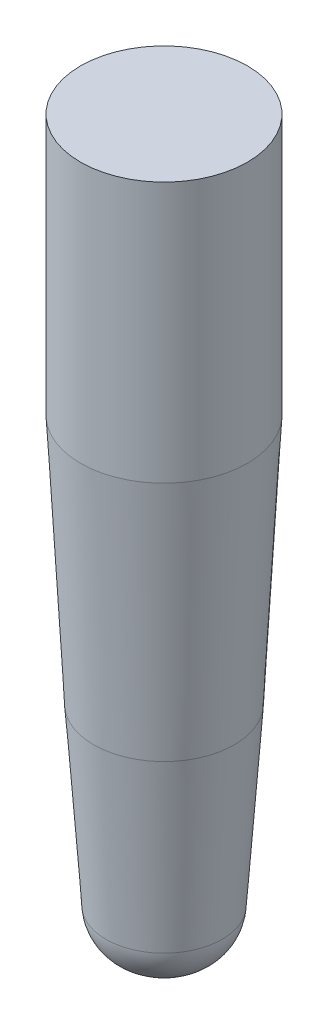
ISO-10303-21;
HEADER;
FILE_DESCRIPTION(('STEP AP214'),'2;1');
FILE_NAME('part.step','',(''),(''),'','','');
FILE_SCHEMA(('AUTOMOTIVE_DESIGN { 1 0 10303 214 1 1 1 1 }'));
ENDSEC;
DATA;
#1=APPLICATION_CONTEXT('core data for automotive mechanical design processes');
#2=APPLICATION_PROTOCOL_DEFINITION('international standard','automotive_design',2000,#1);
#3=PRODUCT_CONTEXT('',#1,'mechanical');
#4=PRODUCT('Part','Part','',(#3));
#5=PRODUCT_RELATED_PRODUCT_CATEGORY('part','',(#4));
#6=PRODUCT_DEFINITION_FORMATION('','',#4);
#7=PRODUCT_DEFINITION_CONTEXT('part definition',#1,'design');
#8=PRODUCT_DEFINITION('design','',#6,#7);
#9=PRODUCT_DEFINITION_SHAPE('','',#8);
#10=(LENGTH_UNIT() NAMED_UNIT(*) SI_UNIT(.MILLI.,.METRE.));
#11=(NAMED_UNIT(*) PLANE_ANGLE_UNIT() SI_UNIT($,.RADIAN.));
#12=(NAMED_UNIT(*) SI_UNIT($,.STERADIAN.) SOLID_ANGLE_UNIT());
#13=UNCERTAINTY_MEASURE_WITH_UNIT(LENGTH_MEASURE(1.E-05),#10,'distance_accuracy_value','');
#14=(GEOMETRIC_REPRESENTATION_CONTEXT(3) GLOBAL_UNCERTAINTY_ASSIGNED_CONTEXT((#13)) GLOBAL_UNIT_ASSIGNED_CONTEXT((#10,
#11,#12)) REPRESENTATION_CONTEXT('',''));
#15=CARTESIAN_POINT('',(0.,0.,0.));
#16=DIRECTION('',(0.,0.,1.));
#17=DIRECTION('',(1.,0.,0.));
#18=AXIS2_PLACEMENT_3D('',#15,#16,#17);
#19=CARTESIAN_POINT('',(0.,25.,0.));
#20=DIRECTION('',(0.,-1.,0.));
#21=DIRECTION('',(0.,0.,-1.));
#22=AXIS2_PLACEMENT_3D('',#19,#20,#21);
#23=CYLINDRICAL_SURFACE('',#22,8.);
#24=CARTESIAN_POINT('',(0.,25.,0.));
#25=DIRECTION('',(0.,1.,0.));
#26=DIRECTION('',(0.,0.,1.));
#27=AXIS2_PLACEMENT_3D('',#24,#25,#26);
#28=CIRCLE('',#27,8.);
#29=CARTESIAN_POINT('',(0.,25.,8.));
#30=VERTEX_POINT('',#29);
#31=EDGE_CURVE('E10',#30,#30,#28,.T.);
#32=ORIENTED_EDGE('',*,*,#31,.F.);
#33=EDGE_LOOP('',(#32));
#34=FACE_BOUND('',#33,.T.);
#35=CARTESIAN_POINT('',(0.,0.,0.));
#36=DIRECTION('',(0.,1.,0.));
#37=DIRECTION('',(0.,0.,1.));
#38=AXIS2_PLACEMENT_3D('',#35,#36,#37);
#39=CIRCLE('',#38,8.);
#40=CARTESIAN_POINT('',(0.,0.,8.));
#41=VERTEX_POINT('',#40);
#42=EDGE_CURVE('E41',#41,#41,#39,.T.);
#43=ORIENTED_EDGE('',*,*,#42,.T.);
#44=EDGE_LOOP('',(#43));
#45=FACE_BOUND('',#44,.T.);
#46=ADVANCED_FACE('F35',(#34,#45),#23,.T.);
#47=CARTESIAN_POINT('',(0.,25.,0.));
#48=DIRECTION('',(0.,1.,0.));
#49=DIRECTION('',(0.,0.,1.));
#50=AXIS2_PLACEMENT_3D('',#47,#48,#49);
#51=PLANE('',#50);
#52=ORIENTED_EDGE('',*,*,#31,.T.);
#53=EDGE_LOOP('',(#52));
#54=FACE_BOUND('',#53,.T.);
#55=ADVANCED_FACE('F79',(#54),#51,.T.);
#56=CARTESIAN_POINT('',(0.,0.,0.));
#57=DIRECTION('',(0.,1.,0.));
#58=DIRECTION('',(0.,0.,1.));
#59=AXIS2_PLACEMENT_3D('',#56,#57,#58);
#60=CONICAL_SURFACE('',#59,8.,0.05235987755983);
#61=CARTESIAN_POINT('',(0.,-24.,0.));
#62=DIRECTION('',(0.,1.,0.));
#63=DIRECTION('',(-1.,0.,0.));
#64=AXIS2_PLACEMENT_3D('',#61,#62,#63);
#65=CIRCLE('',#64,6.74221329720701);
#66=CARTESIAN_POINT('',(-6.74221329720701,-24.,0.));
#67=VERTEX_POINT('',#66);
#68=EDGE_CURVE('E54',#67,#67,#65,.T.);
#69=ORIENTED_EDGE('',*,*,#68,.T.);
#70=EDGE_LOOP('',(#69));
#71=FACE_BOUND('',#70,.T.);
#72=ORIENTED_EDGE('',*,*,#42,.F.);
#73=EDGE_LOOP('',(#72));
#74=FACE_BOUND('',#73,.T.);
#75=ADVANCED_FACE('F58',(#71,#74),#60,.T.);
#76=CARTESIAN_POINT('',(0.,-40.7366603944091,0.));
#77=DIRECTION('',(0.,1.,0.));
#78=DIRECTION('',(-1.,0.,0.));
#79=AXIS2_PLACEMENT_3D('',#76,#77,#78);
#80=CONICAL_SURFACE('',#79,5.5718719932447,0.0698131700797771);
#81=ORIENTED_EDGE('',*,*,#68,.F.);
#82=EDGE_LOOP('',(#81));
#83=FACE_BOUND('',#82,.T.);
#84=CARTESIAN_POINT('',(0.,-40.7366603944091,0.));
#85=DIRECTION('',(0.,1.,0.));
#86=DIRECTION('',(-1.,0.,0.));
#87=AXIS2_PLACEMENT_3D('',#84,#85,#86);
#88=CIRCLE('',#87,5.5718719932447);
#89=CARTESIAN_POINT('',(-5.5718719932447,-40.7366603944091,0.));
#90=VERTEX_POINT('',#89);
#91=EDGE_CURVE('E45',#90,#90,#88,.T.);
#92=ORIENTED_EDGE('',*,*,#91,.T.);
#93=EDGE_LOOP('',(#92));
#94=FACE_BOUND('',#93,.T.);
#95=ADVANCED_FACE('F61',(#83,#94),#80,.T.);
#96=CARTESIAN_POINT('',(0.,-40.4169639613076,0.));
#97=DIRECTION('',(0.,1.,0.));
#98=DIRECTION('',(-1.,0.,0.));
#99=AXIS2_PLACEMENT_3D('',#96,#97,#98);
#100=DEGENERATE_TOROIDAL_SURFACE('',#99,1.,4.58303603869237,.T.);
#101=ORIENTED_EDGE('',*,*,#91,.F.);
#102=EDGE_LOOP('',(#101));
#103=FACE_BOUND('',#102,.T.);
#104=CARTESIAN_POINT('',(0.,-45.,0.));
#105=DIRECTION('',(0.,1.,0.));
#106=DIRECTION('',(-1.,0.,0.));
#107=AXIS2_PLACEMENT_3D('',#104,#105,#106);
#108=CIRCLE('',#107,1.);
#109=CARTESIAN_POINT('',(-0.999999999999997,-45.,0.));
#110=VERTEX_POINT('',#109);
#111=EDGE_CURVE('E49',#110,#110,#108,.T.);
#112=ORIENTED_EDGE('',*,*,#111,.T.);
#113=EDGE_LOOP('',(#112));
#114=FACE_BOUND('',#113,.T.);
#115=ADVANCED_FACE('F64',(#103,#114),#100,.T.);
#116=CARTESIAN_POINT('',(0.,-45.,0.));
#117=DIRECTION('',(0.,1.,0.));
#118=DIRECTION('',(-1.,0.,0.));
#119=AXIS2_PLACEMENT_3D('',#116,#117,#118);
#120=PLANE('',#119);
#121=ORIENTED_EDGE('',*,*,#111,.F.);
#122=EDGE_LOOP('',(#121));
#123=FACE_BOUND('',#122,.T.);
#124=ADVANCED_FACE('F70',(#123),#120,.F.);
#125=CLOSED_SHELL('',(#46,#55,#75,#95,#115,#124));
#126=MANIFOLD_SOLID_BREP('B2',#125);
#127=ADVANCED_BREP_SHAPE_REPRESENTATION('',(#18,#126),#14);
#128=SHAPE_DEFINITION_REPRESENTATION(#9,#127);
ENDSEC;
END-ISO-10303-21;
